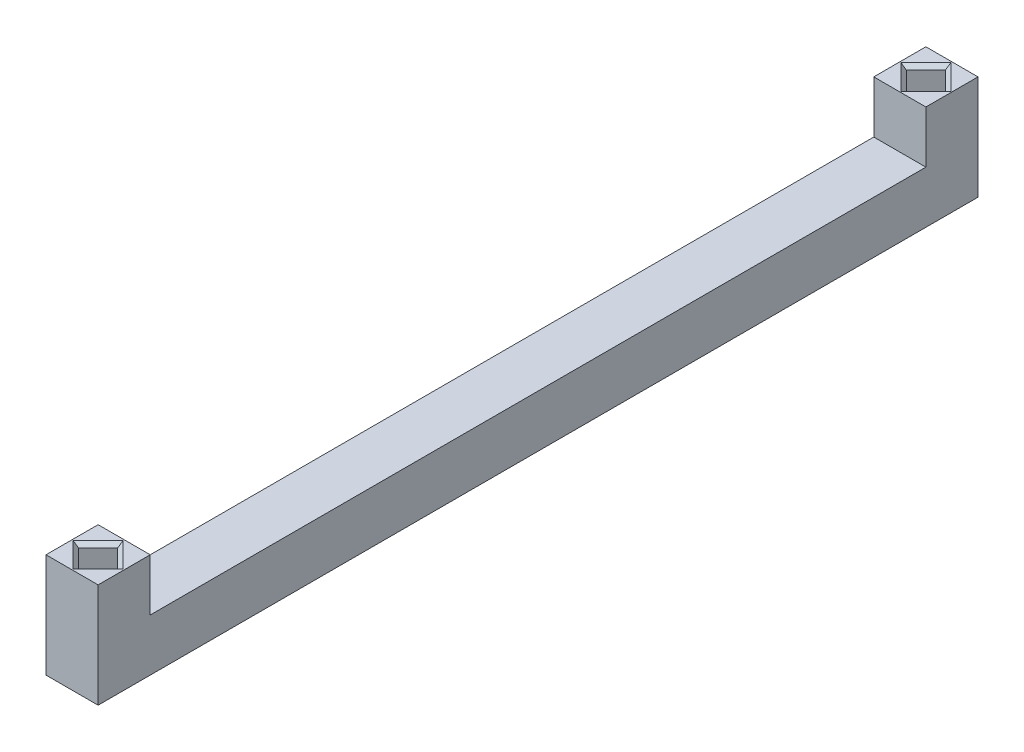
ISO-10303-21;
HEADER;
FILE_DESCRIPTION(('STEP AP214'),'2;1');
FILE_NAME('part.step','',(''),(''),'','','');
FILE_SCHEMA(('AUTOMOTIVE_DESIGN { 1 0 10303 214 1 1 1 1 }'));
ENDSEC;
DATA;
#1=APPLICATION_CONTEXT('core data for automotive mechanical design processes');
#2=APPLICATION_PROTOCOL_DEFINITION('international standard','automotive_design',2000,#1);
#3=PRODUCT_CONTEXT('',#1,'mechanical');
#4=PRODUCT('Part','Part','',(#3));
#5=PRODUCT_RELATED_PRODUCT_CATEGORY('part','',(#4));
#6=PRODUCT_DEFINITION_FORMATION('','',#4);
#7=PRODUCT_DEFINITION_CONTEXT('part definition',#1,'design');
#8=PRODUCT_DEFINITION('design','',#6,#7);
#9=PRODUCT_DEFINITION_SHAPE('','',#8);
#10=(LENGTH_UNIT() NAMED_UNIT(*) SI_UNIT(.MILLI.,.METRE.));
#11=(NAMED_UNIT(*) PLANE_ANGLE_UNIT() SI_UNIT($,.RADIAN.));
#12=(NAMED_UNIT(*) SI_UNIT($,.STERADIAN.) SOLID_ANGLE_UNIT());
#13=UNCERTAINTY_MEASURE_WITH_UNIT(LENGTH_MEASURE(1.E-05),#10,'distance_accuracy_value','');
#14=(GEOMETRIC_REPRESENTATION_CONTEXT(3) GLOBAL_UNCERTAINTY_ASSIGNED_CONTEXT((#13)) GLOBAL_UNIT_ASSIGNED_CONTEXT((#10,
#11,#12)) REPRESENTATION_CONTEXT('',''));
#15=CARTESIAN_POINT('',(0.,0.,0.));
#16=DIRECTION('',(0.,0.,1.));
#17=DIRECTION('',(1.,0.,0.));
#18=AXIS2_PLACEMENT_3D('',#15,#16,#17);
#19=CARTESIAN_POINT('',(8.46666666666667,-8.46666666666666,71.466673));
#20=DIRECTION('',(0.,1.,0.));
#21=DIRECTION('',(0.,0.,1.));
#22=AXIS2_PLACEMENT_3D('',#19,#20,#21);
#23=PLANE('',#22);
#24=DIRECTION('',(0.,0.,-1.));
#25=VECTOR('',#24,1.);
#26=CARTESIAN_POINT('',(0.,-8.46666666666666,71.466673));
#27=LINE('',#26,#25);
#28=CARTESIAN_POINT('',(0.,-8.46666666666666,71.466673));
#29=VERTEX_POINT('',#28);
#30=CARTESIAN_POINT('',(0.,-8.46666666666669,-71.466673));
#31=VERTEX_POINT('',#30);
#32=EDGE_CURVE('E226',#29,#31,#27,.T.);
#33=ORIENTED_EDGE('',*,*,#32,.T.);
#34=DIRECTION('',(-1.,0.,0.));
#35=VECTOR('',#34,1.);
#36=CARTESIAN_POINT('',(8.46666666666667,-8.46666666666669,-71.466673));
#37=LINE('',#36,#35);
#38=CARTESIAN_POINT('',(8.46666666666667,-8.46666666666669,-71.466673));
#39=VERTEX_POINT('',#38);
#40=EDGE_CURVE('E207',#39,#31,#37,.T.);
#41=ORIENTED_EDGE('',*,*,#40,.F.);
#42=DIRECTION('',(0.,0.,-1.));
#43=VECTOR('',#42,1.);
#44=CARTESIAN_POINT('',(8.46666666666667,-8.46666666666666,71.466673));
#45=LINE('',#44,#43);
#46=CARTESIAN_POINT('',(8.46666666666667,-8.46666666666666,71.466673));
#47=VERTEX_POINT('',#46);
#48=EDGE_CURVE('E214',#47,#39,#45,.T.);
#49=ORIENTED_EDGE('',*,*,#48,.F.);
#50=DIRECTION('',(-1.,0.,0.));
#51=VECTOR('',#50,1.);
#52=CARTESIAN_POINT('',(8.46666666666667,-8.46666666666666,71.466673));
#53=LINE('',#52,#51);
#54=EDGE_CURVE('E372',#47,#29,#53,.T.);
#55=ORIENTED_EDGE('',*,*,#54,.T.);
#56=EDGE_LOOP('',(#33,#41,#49,#55));
#57=FACE_BOUND('',#56,.T.);
#58=ADVANCED_FACE('F41',(#57),#23,.F.);
#59=CARTESIAN_POINT('',(8.46666666666667,-8.46666666666669,-71.466673));
#60=DIRECTION('',(0.,0.,1.));
#61=DIRECTION('',(1.,0.,0.));
#62=AXIS2_PLACEMENT_3D('',#59,#60,#61);
#63=PLANE('',#62);
#64=DIRECTION('',(0.,1.,0.));
#65=VECTOR('',#64,1.);
#66=CARTESIAN_POINT('',(0.,-8.46666666666669,-71.466673));
#67=LINE('',#66,#65);
#68=CARTESIAN_POINT('',(0.,8.46666666666669,-71.466673));
#69=VERTEX_POINT('',#68);
#70=EDGE_CURVE('E401',#31,#69,#67,.T.);
#71=ORIENTED_EDGE('',*,*,#70,.T.);
#72=DIRECTION('',(-1.,0.,0.));
#73=VECTOR('',#72,1.);
#74=CARTESIAN_POINT('',(8.46666666666667,8.46666666666669,-71.466673));
#75=LINE('',#74,#73);
#76=CARTESIAN_POINT('',(8.46666666666667,8.46666666666669,-71.466673));
#77=VERTEX_POINT('',#76);
#78=EDGE_CURVE('E210',#77,#69,#75,.T.);
#79=ORIENTED_EDGE('',*,*,#78,.F.);
#80=DIRECTION('',(0.,1.,0.));
#81=VECTOR('',#80,1.);
#82=CARTESIAN_POINT('',(8.46666666666667,-8.46666666666669,-71.466673));
#83=LINE('',#82,#81);
#84=EDGE_CURVE('E203',#39,#77,#83,.T.);
#85=ORIENTED_EDGE('',*,*,#84,.F.);
#86=ORIENTED_EDGE('',*,*,#40,.T.);
#87=EDGE_LOOP('',(#71,#79,#85,#86));
#88=FACE_BOUND('',#87,.T.);
#89=ADVANCED_FACE('F205',(#88),#63,.F.);
#90=CARTESIAN_POINT('',(8.46666666666667,8.46666666666669,-71.466673));
#91=DIRECTION('',(0.,-1.,0.));
#92=DIRECTION('',(0.,0.,-1.));
#93=AXIS2_PLACEMENT_3D('',#90,#91,#92);
#94=PLANE('',#93);
#95=DIRECTION('',(-0.707106781186547,0.,-0.707106781186548));
#96=VECTOR('',#95,1.);
#97=CARTESIAN_POINT('',(2.19682052727985,8.46666666666669,-65.1968268606132));
#98=LINE('',#97,#96);
#99=CARTESIAN_POINT('',(4.23333333333333,8.46666666666669,-63.1603140545597));
#100=VERTEX_POINT('',#99);
#101=CARTESIAN_POINT('',(0.160307721226376,8.46666666666669,-67.2333396666667));
#102=VERTEX_POINT('',#101);
#103=EDGE_CURVE('E290',#100,#102,#98,.T.);
#104=ORIENTED_EDGE('',*,*,#103,.T.);
#105=DIRECTION('',(0.707106781186547,0.,-0.707106781186548));
#106=VECTOR('',#105,1.);
#107=CARTESIAN_POINT('',(6.43015386061318,8.46666666666669,-73.5031858060535));
#108=LINE('',#107,#106);
#109=CARTESIAN_POINT('',(4.23333333333334,8.46666666666669,-71.3063652787736));
#110=VERTEX_POINT('',#109);
#111=EDGE_CURVE('E292',#102,#110,#108,.T.);
#112=ORIENTED_EDGE('',*,*,#111,.T.);
#113=DIRECTION('',(0.707106781186547,0.,0.707106781186548));
#114=VECTOR('',#113,1.);
#115=CARTESIAN_POINT('',(6.26984613938682,8.46666666666669,-69.2698524727201));
#116=LINE('',#115,#114);
#117=CARTESIAN_POINT('',(8.3063589454403,8.46666666666669,-67.2333396666667));
#118=VERTEX_POINT('',#117);
#119=EDGE_CURVE('E286',#110,#118,#116,.T.);
#120=ORIENTED_EDGE('',*,*,#119,.T.);
#121=DIRECTION('',(-0.707106781186548,0.,0.707106781186547));
#122=VECTOR('',#121,1.);
#123=CARTESIAN_POINT('',(10.5031794727201,8.46666666666669,-69.4301601939465));
#124=LINE('',#123,#122);
#125=EDGE_CURVE('E288',#118,#100,#124,.T.);
#126=ORIENTED_EDGE('',*,*,#125,.T.);
#127=EDGE_LOOP('',(#104,#112,#120,#126));
#128=FACE_BOUND('',#127,.T.);
#129=DIRECTION('',(0.,0.,1.));
#130=VECTOR('',#129,1.);
#131=CARTESIAN_POINT('',(0.,8.46666666666669,-71.466673));
#132=LINE('',#131,#130);
#133=CARTESIAN_POINT('',(0.,8.46666666666669,-63.0000063333333));
#134=VERTEX_POINT('',#133);
#135=EDGE_CURVE('E397',#69,#134,#132,.T.);
#136=ORIENTED_EDGE('',*,*,#135,.T.);
#137=DIRECTION('',(-1.,0.,0.));
#138=VECTOR('',#137,1.);
#139=CARTESIAN_POINT('',(8.46666666666667,8.46666666666669,-63.0000063333333));
#140=LINE('',#139,#138);
#141=CARTESIAN_POINT('',(8.46666666666667,8.46666666666669,-63.0000063333333));
#142=VERTEX_POINT('',#141);
#143=EDGE_CURVE('E231',#142,#134,#140,.T.);
#144=ORIENTED_EDGE('',*,*,#143,.F.);
#145=DIRECTION('',(0.,0.,1.));
#146=VECTOR('',#145,1.);
#147=CARTESIAN_POINT('',(8.46666666666667,8.46666666666669,-71.466673));
#148=LINE('',#147,#146);
#149=EDGE_CURVE('E213',#77,#142,#148,.T.);
#150=ORIENTED_EDGE('',*,*,#149,.F.);
#151=ORIENTED_EDGE('',*,*,#78,.T.);
#152=EDGE_LOOP('',(#136,#144,#150,#151));
#153=FACE_BOUND('',#152,.T.);
#154=ADVANCED_FACE('F421',(#128,#153),#94,.F.);
#155=CARTESIAN_POINT('',(8.46666666666667,8.46666666666669,-63.0000063333333));
#156=DIRECTION('',(0.,0.,-1.));
#157=DIRECTION('',(-1.,0.,0.));
#158=AXIS2_PLACEMENT_3D('',#155,#156,#157);
#159=PLANE('',#158);
#160=DIRECTION('',(0.,-1.,0.));
#161=VECTOR('',#160,1.);
#162=CARTESIAN_POINT('',(0.,8.46666666666669,-63.0000063333333));
#163=LINE('',#162,#161);
#164=CARTESIAN_POINT('',(0.,0.,-63.0000063333333));
#165=VERTEX_POINT('',#164);
#166=EDGE_CURVE('E392',#134,#165,#163,.T.);
#167=ORIENTED_EDGE('',*,*,#166,.T.);
#168=DIRECTION('',(-1.,0.,0.));
#169=VECTOR('',#168,1.);
#170=CARTESIAN_POINT('',(8.46666666666667,0.,-63.0000063333333));
#171=LINE('',#170,#169);
#172=CARTESIAN_POINT('',(8.46666666666667,0.,-63.0000063333333));
#173=VERTEX_POINT('',#172);
#174=EDGE_CURVE('E383',#173,#165,#171,.T.);
#175=ORIENTED_EDGE('',*,*,#174,.F.);
#176=DIRECTION('',(0.,-1.,0.));
#177=VECTOR('',#176,1.);
#178=CARTESIAN_POINT('',(8.46666666666667,8.46666666666669,-63.0000063333333));
#179=LINE('',#178,#177);
#180=EDGE_CURVE('E393',#142,#173,#179,.T.);
#181=ORIENTED_EDGE('',*,*,#180,.F.);
#182=ORIENTED_EDGE('',*,*,#143,.T.);
#183=EDGE_LOOP('',(#167,#175,#181,#182));
#184=FACE_BOUND('',#183,.T.);
#185=ADVANCED_FACE('F390',(#184),#159,.F.);
#186=CARTESIAN_POINT('',(8.46666666666667,0.,-63.0000063333333));
#187=DIRECTION('',(0.,-1.,0.));
#188=DIRECTION('',(0.,0.,-1.));
#189=AXIS2_PLACEMENT_3D('',#186,#187,#188);
#190=PLANE('',#189);
#191=DIRECTION('',(0.,0.,1.));
#192=VECTOR('',#191,1.);
#193=CARTESIAN_POINT('',(0.,0.,-63.0000063333333));
#194=LINE('',#193,#192);
#195=CARTESIAN_POINT('',(0.,0.,63.0000063333333));
#196=VERTEX_POINT('',#195);
#197=EDGE_CURVE('E398',#165,#196,#194,.T.);
#198=ORIENTED_EDGE('',*,*,#197,.T.);
#199=DIRECTION('',(-1.,0.,0.));
#200=VECTOR('',#199,1.);
#201=CARTESIAN_POINT('',(8.46666666666667,0.,63.0000063333333));
#202=LINE('',#201,#200);
#203=CARTESIAN_POINT('',(8.46666666666667,0.,63.0000063333333));
#204=VERTEX_POINT('',#203);
#205=EDGE_CURVE('E380',#204,#196,#202,.T.);
#206=ORIENTED_EDGE('',*,*,#205,.F.);
#207=DIRECTION('',(0.,0.,1.));
#208=VECTOR('',#207,1.);
#209=CARTESIAN_POINT('',(8.46666666666667,0.,-63.0000063333333));
#210=LINE('',#209,#208);
#211=EDGE_CURVE('E411',#173,#204,#210,.T.);
#212=ORIENTED_EDGE('',*,*,#211,.F.);
#213=ORIENTED_EDGE('',*,*,#174,.T.);
#214=EDGE_LOOP('',(#198,#206,#212,#213));
#215=FACE_BOUND('',#214,.T.);
#216=ADVANCED_FACE('F410',(#215),#190,.F.);
#217=CARTESIAN_POINT('',(8.46666666666667,0.,63.0000063333333));
#218=DIRECTION('',(0.,0.,1.));
#219=DIRECTION('',(1.,0.,0.));
#220=AXIS2_PLACEMENT_3D('',#217,#218,#219);
#221=PLANE('',#220);
#222=DIRECTION('',(0.,1.,0.));
#223=VECTOR('',#222,1.);
#224=CARTESIAN_POINT('',(0.,0.,63.0000063333333));
#225=LINE('',#224,#223);
#226=CARTESIAN_POINT('',(0.,8.46666666666667,63.0000063333333));
#227=VERTEX_POINT('',#226);
#228=EDGE_CURVE('E369',#196,#227,#225,.T.);
#229=ORIENTED_EDGE('',*,*,#228,.T.);
#230=DIRECTION('',(-1.,0.,0.));
#231=VECTOR('',#230,1.);
#232=CARTESIAN_POINT('',(8.46666666666667,8.46666666666667,63.0000063333333));
#233=LINE('',#232,#231);
#234=CARTESIAN_POINT('',(8.46666666666667,8.46666666666667,63.0000063333333));
#235=VERTEX_POINT('',#234);
#236=EDGE_CURVE('E365',#235,#227,#233,.T.);
#237=ORIENTED_EDGE('',*,*,#236,.F.);
#238=DIRECTION('',(0.,1.,0.));
#239=VECTOR('',#238,1.);
#240=CARTESIAN_POINT('',(8.46666666666667,0.,63.0000063333333));
#241=LINE('',#240,#239);
#242=EDGE_CURVE('E407',#204,#235,#241,.T.);
#243=ORIENTED_EDGE('',*,*,#242,.F.);
#244=ORIENTED_EDGE('',*,*,#205,.T.);
#245=EDGE_LOOP('',(#229,#237,#243,#244));
#246=FACE_BOUND('',#245,.T.);
#247=ADVANCED_FACE('F355',(#246),#221,.F.);
#248=CARTESIAN_POINT('',(8.46666666666667,8.46666666666667,63.0000063333333));
#249=DIRECTION('',(0.,-1.,0.));
#250=DIRECTION('',(0.,0.,-1.));
#251=AXIS2_PLACEMENT_3D('',#248,#249,#250);
#252=PLANE('',#251);
#253=DIRECTION('',(-0.707106781186548,0.,-0.707106781186547));
#254=VECTOR('',#253,1.);
#255=CARTESIAN_POINT('',(2.19682052727988,8.46666666666667,69.2698524727201));
#256=LINE('',#255,#254);
#257=CARTESIAN_POINT('',(4.23333333333334,8.46666666666667,71.3063652787736));
#258=VERTEX_POINT('',#257);
#259=CARTESIAN_POINT('',(0.16030772122642,8.46666666666667,67.2333396666667));
#260=VERTEX_POINT('',#259);
#261=EDGE_CURVE('E51',#258,#260,#256,.T.);
#262=ORIENTED_EDGE('',*,*,#261,.T.);
#263=DIRECTION('',(0.707106781186548,0.,-0.707106781186547));
#264=VECTOR('',#263,1.);
#265=CARTESIAN_POINT('',(6.43015386061322,8.46666666666667,60.9634935272799));
#266=LINE('',#265,#264);
#267=CARTESIAN_POINT('',(4.23333333333333,8.46666666666667,63.1603140545598));
#268=VERTEX_POINT('',#267);
#269=EDGE_CURVE('E11',#260,#268,#266,.T.);
#270=ORIENTED_EDGE('',*,*,#269,.T.);
#271=DIRECTION('',(0.707106781186547,0.,0.707106781186548));
#272=VECTOR('',#271,1.);
#273=CARTESIAN_POINT('',(6.26984613938679,8.46666666666667,65.1968268606132));
#274=LINE('',#273,#272);
#275=CARTESIAN_POINT('',(8.30635894544025,8.46666666666667,67.2333396666667));
#276=VERTEX_POINT('',#275);
#277=EDGE_CURVE('E295',#268,#276,#274,.T.);
#278=ORIENTED_EDGE('',*,*,#277,.T.);
#279=DIRECTION('',(-0.707106781186547,0.,0.707106781186548));
#280=VECTOR('',#279,1.);
#281=CARTESIAN_POINT('',(10.5031794727201,8.46666666666667,65.0365191393868));
#282=LINE('',#281,#280);
#283=EDGE_CURVE('E62',#276,#258,#282,.T.);
#284=ORIENTED_EDGE('',*,*,#283,.T.);
#285=EDGE_LOOP('',(#262,#270,#278,#284));
#286=FACE_BOUND('',#285,.T.);
#287=DIRECTION('',(0.,0.,1.));
#288=VECTOR('',#287,1.);
#289=CARTESIAN_POINT('',(0.,8.46666666666667,63.0000063333333));
#290=LINE('',#289,#288);
#291=CARTESIAN_POINT('',(0.,8.46666666666667,71.466673));
#292=VERTEX_POINT('',#291);
#293=EDGE_CURVE('E360',#227,#292,#290,.T.);
#294=ORIENTED_EDGE('',*,*,#293,.T.);
#295=DIRECTION('',(-1.,0.,0.));
#296=VECTOR('',#295,1.);
#297=CARTESIAN_POINT('',(8.46666666666667,8.46666666666667,71.466673));
#298=LINE('',#297,#296);
#299=CARTESIAN_POINT('',(8.46666666666667,8.46666666666667,71.466673));
#300=VERTEX_POINT('',#299);
#301=EDGE_CURVE('E363',#300,#292,#298,.T.);
#302=ORIENTED_EDGE('',*,*,#301,.F.);
#303=DIRECTION('',(0.,0.,1.));
#304=VECTOR('',#303,1.);
#305=CARTESIAN_POINT('',(8.46666666666667,8.46666666666667,63.0000063333333));
#306=LINE('',#305,#304);
#307=EDGE_CURVE('E413',#235,#300,#306,.T.);
#308=ORIENTED_EDGE('',*,*,#307,.F.);
#309=ORIENTED_EDGE('',*,*,#236,.T.);
#310=EDGE_LOOP('',(#294,#302,#308,#309));
#311=FACE_BOUND('',#310,.T.);
#312=ADVANCED_FACE('F351',(#286,#311),#252,.F.);
#313=CARTESIAN_POINT('',(8.46666666666667,8.46666666666667,71.466673));
#314=DIRECTION('',(0.,0.,-1.));
#315=DIRECTION('',(-1.,0.,0.));
#316=AXIS2_PLACEMENT_3D('',#313,#314,#315);
#317=PLANE('',#316);
#318=DIRECTION('',(0.,-1.,0.));
#319=VECTOR('',#318,1.);
#320=CARTESIAN_POINT('',(0.,8.46666666666667,71.466673));
#321=LINE('',#320,#319);
#322=EDGE_CURVE('E223',#292,#29,#321,.T.);
#323=ORIENTED_EDGE('',*,*,#322,.T.);
#324=ORIENTED_EDGE('',*,*,#54,.F.);
#325=DIRECTION('',(0.,-1.,0.));
#326=VECTOR('',#325,1.);
#327=CARTESIAN_POINT('',(8.46666666666667,8.46666666666667,71.466673));
#328=LINE('',#327,#326);
#329=EDGE_CURVE('E219',#300,#47,#328,.T.);
#330=ORIENTED_EDGE('',*,*,#329,.F.);
#331=ORIENTED_EDGE('',*,*,#301,.T.);
#332=EDGE_LOOP('',(#323,#324,#330,#331));
#333=FACE_BOUND('',#332,.T.);
#334=ADVANCED_FACE('F354',(#333),#317,.F.);
#335=CARTESIAN_POINT('',(8.46666666666667,0.,0.));
#336=DIRECTION('',(1.,0.,0.));
#337=DIRECTION('',(0.,0.,-1.));
#338=AXIS2_PLACEMENT_3D('',#335,#336,#337);
#339=PLANE('',#338);
#340=ORIENTED_EDGE('',*,*,#48,.T.);
#341=ORIENTED_EDGE('',*,*,#84,.T.);
#342=ORIENTED_EDGE('',*,*,#149,.T.);
#343=ORIENTED_EDGE('',*,*,#180,.T.);
#344=ORIENTED_EDGE('',*,*,#211,.T.);
#345=ORIENTED_EDGE('',*,*,#242,.T.);
#346=ORIENTED_EDGE('',*,*,#307,.T.);
#347=ORIENTED_EDGE('',*,*,#329,.T.);
#348=EDGE_LOOP('',(#340,#341,#342,#343,#344,#345,#346,#347));
#349=FACE_BOUND('',#348,.T.);
#350=ADVANCED_FACE('F217',(#349),#339,.T.);
#351=CARTESIAN_POINT('',(0.,0.,0.));
#352=DIRECTION('',(1.,0.,0.));
#353=DIRECTION('',(0.,0.,-1.));
#354=AXIS2_PLACEMENT_3D('',#351,#352,#353);
#355=PLANE('',#354);
#356=ORIENTED_EDGE('',*,*,#32,.F.);
#357=ORIENTED_EDGE('',*,*,#322,.F.);
#358=ORIENTED_EDGE('',*,*,#293,.F.);
#359=ORIENTED_EDGE('',*,*,#228,.F.);
#360=ORIENTED_EDGE('',*,*,#197,.F.);
#361=ORIENTED_EDGE('',*,*,#166,.F.);
#362=ORIENTED_EDGE('',*,*,#135,.F.);
#363=ORIENTED_EDGE('',*,*,#70,.F.);
#364=EDGE_LOOP('',(#356,#357,#358,#359,#360,#361,#362,#363));
#365=FACE_BOUND('',#364,.T.);
#366=ADVANCED_FACE('F374',(#365),#355,.F.);
#367=CARTESIAN_POINT('',(1.05833333333333,3.38666666666667,67.2333396666667));
#368=DIRECTION('',(-0.707106781186547,0.,0.707106781186548));
#369=DIRECTION('',(0.707106781186548,0.,0.707106781186547));
#370=AXIS2_PLACEMENT_3D('',#367,#368,#369);
#371=PLANE('',#370);
#372=DIRECTION('',(0.,1.,0.));
#373=VECTOR('',#372,1.);
#374=CARTESIAN_POINT('',(4.23333333333333,3.38666666666667,70.4083396666667));
#375=LINE('',#374,#373);
#376=CARTESIAN_POINT('',(4.23333333333333,4.02166666666668,70.4083396666667));
#377=VERTEX_POINT('',#376);
#378=CARTESIAN_POINT('',(4.23333333333333,7.83166666666666,70.4083396666667));
#379=VERTEX_POINT('',#378);
#380=EDGE_CURVE('E434',#377,#379,#375,.T.);
#381=ORIENTED_EDGE('',*,*,#380,.F.);
#382=DIRECTION('',(-0.707106781186548,0.,-0.707106781186547));
#383=VECTOR('',#382,1.);
#384=CARTESIAN_POINT('',(1.05833333333333,4.02166666666668,67.2333396666667));
#385=LINE('',#384,#383);
#386=CARTESIAN_POINT('',(1.05833333333333,4.02166666666668,67.2333396666667));
#387=VERTEX_POINT('',#386);
#388=EDGE_CURVE('E284',#377,#387,#385,.T.);
#389=ORIENTED_EDGE('',*,*,#388,.T.);
#390=DIRECTION('',(0.,1.,0.));
#391=VECTOR('',#390,1.);
#392=CARTESIAN_POINT('',(1.05833333333333,3.38666666666667,67.2333396666667));
#393=LINE('',#392,#391);
#394=CARTESIAN_POINT('',(1.05833333333333,7.83166666666666,67.2333396666667));
#395=VERTEX_POINT('',#394);
#396=EDGE_CURVE('E420',#387,#395,#393,.T.);
#397=ORIENTED_EDGE('',*,*,#396,.T.);
#398=DIRECTION('',(0.707106781186548,0.,0.707106781186547));
#399=VECTOR('',#398,1.);
#400=CARTESIAN_POINT('',(1.05833333333333,7.83166666666666,67.2333396666667));
#401=LINE('',#400,#399);
#402=EDGE_CURVE('E282',#395,#379,#401,.T.);
#403=ORIENTED_EDGE('',*,*,#402,.T.);
#404=EDGE_LOOP('',(#381,#389,#397,#403));
#405=FACE_BOUND('',#404,.T.);
#406=ADVANCED_FACE('F447',(#405),#371,.F.);
#407=CARTESIAN_POINT('',(1.05833333333333,3.38666666666667,67.2333396666667));
#408=DIRECTION('',(-0.707106781186547,0.,-0.707106781186548));
#409=DIRECTION('',(-0.707106781186548,0.,0.707106781186547));
#410=AXIS2_PLACEMENT_3D('',#407,#408,#409);
#411=PLANE('',#410);
#412=ORIENTED_EDGE('',*,*,#396,.F.);
#413=DIRECTION('',(0.707106781186548,0.,-0.707106781186547));
#414=VECTOR('',#413,1.);
#415=CARTESIAN_POINT('',(1.05833333333333,4.02166666666668,67.2333396666667));
#416=LINE('',#415,#414);
#417=CARTESIAN_POINT('',(4.23333333333333,4.02166666666668,64.0583396666667));
#418=VERTEX_POINT('',#417);
#419=EDGE_CURVE('E271',#387,#418,#416,.T.);
#420=ORIENTED_EDGE('',*,*,#419,.T.);
#421=DIRECTION('',(0.,1.,0.));
#422=VECTOR('',#421,1.);
#423=CARTESIAN_POINT('',(4.23333333333333,3.38666666666667,64.0583396666667));
#424=LINE('',#423,#422);
#425=CARTESIAN_POINT('',(4.23333333333333,7.83166666666666,64.0583396666667));
#426=VERTEX_POINT('',#425);
#427=EDGE_CURVE('E440',#418,#426,#424,.T.);
#428=ORIENTED_EDGE('',*,*,#427,.T.);
#429=DIRECTION('',(-0.707106781186548,0.,0.707106781186547));
#430=VECTOR('',#429,1.);
#431=CARTESIAN_POINT('',(1.05833333333333,7.83166666666666,67.2333396666667));
#432=LINE('',#431,#430);
#433=EDGE_CURVE('E268',#426,#395,#432,.T.);
#434=ORIENTED_EDGE('',*,*,#433,.T.);
#435=EDGE_LOOP('',(#412,#420,#428,#434));
#436=FACE_BOUND('',#435,.T.);
#437=ADVANCED_FACE('F451',(#436),#411,.F.);
#438=CARTESIAN_POINT('',(4.23333333333333,3.38666666666667,64.0583396666667));
#439=DIRECTION('',(0.707106781186548,0.,-0.707106781186547));
#440=DIRECTION('',(-0.707106781186547,0.,-0.707106781186548));
#441=AXIS2_PLACEMENT_3D('',#438,#439,#440);
#442=PLANE('',#441);
#443=ORIENTED_EDGE('',*,*,#427,.F.);
#444=DIRECTION('',(0.707106781186547,0.,0.707106781186548));
#445=VECTOR('',#444,1.);
#446=CARTESIAN_POINT('',(4.23333333333333,4.02166666666668,64.0583396666667));
#447=LINE('',#446,#445);
#448=CARTESIAN_POINT('',(7.40833333333333,4.02166666666668,67.2333396666667));
#449=VERTEX_POINT('',#448);
#450=EDGE_CURVE('E276',#418,#449,#447,.T.);
#451=ORIENTED_EDGE('',*,*,#450,.T.);
#452=DIRECTION('',(0.,1.,0.));
#453=VECTOR('',#452,1.);
#454=CARTESIAN_POINT('',(7.40833333333333,3.38666666666667,67.2333396666667));
#455=LINE('',#454,#453);
#456=CARTESIAN_POINT('',(7.40833333333333,7.83166666666666,67.2333396666667));
#457=VERTEX_POINT('',#456);
#458=EDGE_CURVE('E437',#449,#457,#455,.T.);
#459=ORIENTED_EDGE('',*,*,#458,.T.);
#460=DIRECTION('',(-0.707106781186547,0.,-0.707106781186548));
#461=VECTOR('',#460,1.);
#462=CARTESIAN_POINT('',(4.23333333333333,7.83166666666666,64.0583396666667));
#463=LINE('',#462,#461);
#464=EDGE_CURVE('E274',#457,#426,#463,.T.);
#465=ORIENTED_EDGE('',*,*,#464,.T.);
#466=EDGE_LOOP('',(#443,#451,#459,#465));
#467=FACE_BOUND('',#466,.T.);
#468=ADVANCED_FACE('F472',(#467),#442,.F.);
#469=CARTESIAN_POINT('',(4.23333333333333,3.38666666666667,70.4083396666667));
#470=DIRECTION('',(0.707106781186548,0.,0.707106781186547));
#471=DIRECTION('',(0.707106781186547,0.,-0.707106781186548));
#472=AXIS2_PLACEMENT_3D('',#469,#470,#471);
#473=PLANE('',#472);
#474=ORIENTED_EDGE('',*,*,#458,.F.);
#475=DIRECTION('',(-0.707106781186547,0.,0.707106781186548));
#476=VECTOR('',#475,1.);
#477=CARTESIAN_POINT('',(4.23333333333333,4.02166666666668,70.4083396666667));
#478=LINE('',#477,#476);
#479=EDGE_CURVE('E280',#449,#377,#478,.T.);
#480=ORIENTED_EDGE('',*,*,#479,.T.);
#481=ORIENTED_EDGE('',*,*,#380,.T.);
#482=DIRECTION('',(0.707106781186547,0.,-0.707106781186548));
#483=VECTOR('',#482,1.);
#484=CARTESIAN_POINT('',(4.23333333333333,7.83166666666666,70.4083396666667));
#485=LINE('',#484,#483);
#486=EDGE_CURVE('E278',#379,#457,#485,.T.);
#487=ORIENTED_EDGE('',*,*,#486,.T.);
#488=EDGE_LOOP('',(#474,#480,#481,#487));
#489=FACE_BOUND('',#488,.T.);
#490=ADVANCED_FACE('F475',(#489),#473,.F.);
#491=CARTESIAN_POINT('',(0.,3.38666666666667,0.));
#492=DIRECTION('',(0.,1.,0.));
#493=DIRECTION('',(0.,0.,1.));
#494=AXIS2_PLACEMENT_3D('',#491,#492,#493);
#495=PLANE('',#494);
#496=DIRECTION('',(-0.707106781186547,0.,-0.707106781186548));
#497=VECTOR('',#496,1.);
#498=CARTESIAN_POINT('',(-30.3615159727202,3.38666666666667,30.3615159727201));
#499=LINE('',#498,#497);
#500=CARTESIAN_POINT('',(6.51030772122636,3.38666666666667,67.2333396666667));
#501=VERTEX_POINT('',#500);
#502=CARTESIAN_POINT('',(4.23333333333333,3.38666666666667,64.9563652787736));
#503=VERTEX_POINT('',#502);
#504=EDGE_CURVE('E263',#501,#503,#499,.T.);
#505=ORIENTED_EDGE('',*,*,#504,.T.);
#506=DIRECTION('',(-0.707106781186548,0.,0.707106781186547));
#507=VECTOR('',#506,1.);
#508=CARTESIAN_POINT('',(34.5948493060535,3.38666666666667,34.5948493060535));
#509=LINE('',#508,#507);
#510=CARTESIAN_POINT('',(1.9563589454403,3.38666666666667,67.2333396666667));
#511=VERTEX_POINT('',#510);
#512=EDGE_CURVE('E265',#503,#511,#509,.T.);
#513=ORIENTED_EDGE('',*,*,#512,.T.);
#514=DIRECTION('',(0.707106781186548,0.,0.707106781186547));
#515=VECTOR('',#514,1.);
#516=CARTESIAN_POINT('',(-32.6384903606132,3.38666666666667,32.6384903606132));
#517=LINE('',#516,#515);
#518=CARTESIAN_POINT('',(4.23333333333333,3.38666666666667,69.5103140545597));
#519=VERTEX_POINT('',#518);
#520=EDGE_CURVE('E259',#511,#519,#517,.T.);
#521=ORIENTED_EDGE('',*,*,#520,.T.);
#522=DIRECTION('',(0.707106781186547,0.,-0.707106781186548));
#523=VECTOR('',#522,1.);
#524=CARTESIAN_POINT('',(36.8718236939465,3.38666666666667,36.8718236939465));
#525=LINE('',#524,#523);
#526=EDGE_CURVE('E261',#519,#501,#525,.T.);
#527=ORIENTED_EDGE('',*,*,#526,.T.);
#528=EDGE_LOOP('',(#505,#513,#521,#527));
#529=FACE_BOUND('',#528,.T.);
#530=ADVANCED_FACE('F465',(#529),#495,.T.);
#531=CARTESIAN_POINT('',(1.05833333333335,3.38666666666667,-67.2333396666667));
#532=DIRECTION('',(-0.707106781186548,0.,0.707106781186547));
#533=DIRECTION('',(0.707106781186547,0.,0.707106781186548));
#534=AXIS2_PLACEMENT_3D('',#531,#532,#533);
#535=PLANE('',#534);
#536=DIRECTION('',(0.,1.,0.));
#537=VECTOR('',#536,1.);
#538=CARTESIAN_POINT('',(4.23333333333334,3.38666666666667,-64.0583396666667));
#539=LINE('',#538,#537);
#540=CARTESIAN_POINT('',(4.23333333333334,4.02166666666666,-64.0583396666667));
#541=VERTEX_POINT('',#540);
#542=CARTESIAN_POINT('',(4.23333333333334,7.83166666666665,-64.0583396666667));
#543=VERTEX_POINT('',#542);
#544=EDGE_CURVE('E431',#541,#543,#539,.T.);
#545=ORIENTED_EDGE('',*,*,#544,.F.);
#546=DIRECTION('',(-0.707106781186547,0.,-0.707106781186548));
#547=VECTOR('',#546,1.);
#548=CARTESIAN_POINT('',(1.05833333333335,4.02166666666666,-67.2333396666667));
#549=LINE('',#548,#547);
#550=CARTESIAN_POINT('',(1.05833333333335,4.02166666666666,-67.2333396666667));
#551=VERTEX_POINT('',#550);
#552=EDGE_CURVE('E257',#541,#551,#549,.T.);
#553=ORIENTED_EDGE('',*,*,#552,.T.);
#554=DIRECTION('',(0.,1.,0.));
#555=VECTOR('',#554,1.);
#556=CARTESIAN_POINT('',(1.05833333333335,3.38666666666667,-67.2333396666667));
#557=LINE('',#556,#555);
#558=CARTESIAN_POINT('',(1.05833333333335,7.83166666666665,-67.2333396666667));
#559=VERTEX_POINT('',#558);
#560=EDGE_CURVE('E310',#551,#559,#557,.T.);
#561=ORIENTED_EDGE('',*,*,#560,.T.);
#562=DIRECTION('',(0.707106781186547,0.,0.707106781186548));
#563=VECTOR('',#562,1.);
#564=CARTESIAN_POINT('',(1.05833333333335,7.83166666666665,-67.2333396666667));
#565=LINE('',#564,#563);
#566=EDGE_CURVE('E255',#559,#543,#565,.T.);
#567=ORIENTED_EDGE('',*,*,#566,.T.);
#568=EDGE_LOOP('',(#545,#553,#561,#567));
#569=FACE_BOUND('',#568,.T.);
#570=ADVANCED_FACE('F681',(#569),#535,.F.);
#571=CARTESIAN_POINT('',(1.05833333333335,3.38666666666667,-67.2333396666667));
#572=DIRECTION('',(-0.707106781186548,0.,-0.707106781186547));
#573=DIRECTION('',(-0.707106781186547,0.,0.707106781186548));
#574=AXIS2_PLACEMENT_3D('',#571,#572,#573);
#575=PLANE('',#574);
#576=ORIENTED_EDGE('',*,*,#560,.F.);
#577=DIRECTION('',(0.707106781186547,0.,-0.707106781186548));
#578=VECTOR('',#577,1.);
#579=CARTESIAN_POINT('',(1.05833333333335,4.02166666666666,-67.2333396666667));
#580=LINE('',#579,#578);
#581=CARTESIAN_POINT('',(4.23333333333334,4.02166666666667,-70.4083396666667));
#582=VERTEX_POINT('',#581);
#583=EDGE_CURVE('E244',#551,#582,#580,.T.);
#584=ORIENTED_EDGE('',*,*,#583,.T.);
#585=DIRECTION('',(0.,1.,0.));
#586=VECTOR('',#585,1.);
#587=CARTESIAN_POINT('',(4.23333333333334,3.38666666666667,-70.4083396666667));
#588=LINE('',#587,#586);
#589=CARTESIAN_POINT('',(4.23333333333334,7.83166666666665,-70.4083396666667));
#590=VERTEX_POINT('',#589);
#591=EDGE_CURVE('E425',#582,#590,#588,.T.);
#592=ORIENTED_EDGE('',*,*,#591,.T.);
#593=DIRECTION('',(-0.707106781186547,0.,0.707106781186548));
#594=VECTOR('',#593,1.);
#595=CARTESIAN_POINT('',(1.05833333333335,7.83166666666665,-67.2333396666667));
#596=LINE('',#595,#594);
#597=EDGE_CURVE('E241',#590,#559,#596,.T.);
#598=ORIENTED_EDGE('',*,*,#597,.T.);
#599=EDGE_LOOP('',(#576,#584,#592,#598));
#600=FACE_BOUND('',#599,.T.);
#601=ADVANCED_FACE('F672',(#600),#575,.F.);
#602=CARTESIAN_POINT('',(4.23333333333334,3.38666666666667,-70.4083396666667));
#603=DIRECTION('',(0.707106781186548,0.,-0.707106781186547));
#604=DIRECTION('',(-0.707106781186547,0.,-0.707106781186548));
#605=AXIS2_PLACEMENT_3D('',#602,#603,#604);
#606=PLANE('',#605);
#607=ORIENTED_EDGE('',*,*,#591,.F.);
#608=DIRECTION('',(0.707106781186547,0.,0.707106781186548));
#609=VECTOR('',#608,1.);
#610=CARTESIAN_POINT('',(4.23333333333334,4.02166666666667,-70.4083396666667));
#611=LINE('',#610,#609);
#612=CARTESIAN_POINT('',(7.40833333333333,4.02166666666666,-67.2333396666667));
#613=VERTEX_POINT('',#612);
#614=EDGE_CURVE('E249',#582,#613,#611,.T.);
#615=ORIENTED_EDGE('',*,*,#614,.T.);
#616=DIRECTION('',(0.,1.,0.));
#617=VECTOR('',#616,1.);
#618=CARTESIAN_POINT('',(7.40833333333333,3.38666666666667,-67.2333396666667));
#619=LINE('',#618,#617);
#620=CARTESIAN_POINT('',(7.40833333333333,7.83166666666665,-67.2333396666667));
#621=VERTEX_POINT('',#620);
#622=EDGE_CURVE('E428',#613,#621,#619,.T.);
#623=ORIENTED_EDGE('',*,*,#622,.T.);
#624=DIRECTION('',(-0.707106781186547,0.,-0.707106781186548));
#625=VECTOR('',#624,1.);
#626=CARTESIAN_POINT('',(4.23333333333334,7.83166666666665,-70.4083396666667));
#627=LINE('',#626,#625);
#628=EDGE_CURVE('E247',#621,#590,#627,.T.);
#629=ORIENTED_EDGE('',*,*,#628,.T.);
#630=EDGE_LOOP('',(#607,#615,#623,#629));
#631=FACE_BOUND('',#630,.T.);
#632=ADVANCED_FACE('F663',(#631),#606,.F.);
#633=CARTESIAN_POINT('',(4.23333333333334,3.38666666666667,-64.0583396666667));
#634=DIRECTION('',(0.707106781186547,0.,0.707106781186548));
#635=DIRECTION('',(0.707106781186548,0.,-0.707106781186547));
#636=AXIS2_PLACEMENT_3D('',#633,#634,#635);
#637=PLANE('',#636);
#638=ORIENTED_EDGE('',*,*,#622,.F.);
#639=DIRECTION('',(-0.707106781186548,0.,0.707106781186547));
#640=VECTOR('',#639,1.);
#641=CARTESIAN_POINT('',(4.23333333333334,4.02166666666666,-64.0583396666667));
#642=LINE('',#641,#640);
#643=EDGE_CURVE('E253',#613,#541,#642,.T.);
#644=ORIENTED_EDGE('',*,*,#643,.T.);
#645=ORIENTED_EDGE('',*,*,#544,.T.);
#646=DIRECTION('',(0.707106781186548,0.,-0.707106781186547));
#647=VECTOR('',#646,1.);
#648=CARTESIAN_POINT('',(4.23333333333334,7.83166666666665,-64.0583396666667));
#649=LINE('',#648,#647);
#650=EDGE_CURVE('E251',#543,#621,#649,.T.);
#651=ORIENTED_EDGE('',*,*,#650,.T.);
#652=EDGE_LOOP('',(#638,#644,#645,#651));
#653=FACE_BOUND('',#652,.T.);
#654=ADVANCED_FACE('F654',(#653),#637,.F.);
#655=CARTESIAN_POINT('',(0.,3.38666666666667,0.));
#656=DIRECTION('',(0.,1.,0.));
#657=DIRECTION('',(0.,0.,1.));
#658=AXIS2_PLACEMENT_3D('',#655,#656,#657);
#659=PLANE('',#658);
#660=DIRECTION('',(-0.707106781186547,0.,-0.707106781186548));
#661=VECTOR('',#660,1.);
#662=CARTESIAN_POINT('',(36.8718236939465,3.38666666666667,-36.8718236939465));
#663=LINE('',#662,#661);
#664=CARTESIAN_POINT('',(6.51030772122642,3.38666666666667,-67.2333396666667));
#665=VERTEX_POINT('',#664);
#666=CARTESIAN_POINT('',(4.23333333333334,3.38666666666667,-69.5103140545597));
#667=VERTEX_POINT('',#666);
#668=EDGE_CURVE('E236',#665,#667,#663,.T.);
#669=ORIENTED_EDGE('',*,*,#668,.T.);
#670=DIRECTION('',(-0.707106781186547,0.,0.707106781186548));
#671=VECTOR('',#670,1.);
#672=CARTESIAN_POINT('',(-32.6384903606132,3.38666666666667,-32.6384903606132));
#673=LINE('',#672,#671);
#674=CARTESIAN_POINT('',(1.95635894544027,3.38666666666667,-67.2333396666667));
#675=VERTEX_POINT('',#674);
#676=EDGE_CURVE('E238',#667,#675,#673,.T.);
#677=ORIENTED_EDGE('',*,*,#676,.T.);
#678=DIRECTION('',(0.707106781186547,0.,0.707106781186548));
#679=VECTOR('',#678,1.);
#680=CARTESIAN_POINT('',(34.5948493060535,3.38666666666667,-34.5948493060534));
#681=LINE('',#680,#679);
#682=CARTESIAN_POINT('',(4.23333333333334,3.38666666666667,-64.9563652787736));
#683=VERTEX_POINT('',#682);
#684=EDGE_CURVE('E227',#675,#683,#681,.T.);
#685=ORIENTED_EDGE('',*,*,#684,.T.);
#686=DIRECTION('',(0.707106781186548,0.,-0.707106781186547));
#687=VECTOR('',#686,1.);
#688=CARTESIAN_POINT('',(-30.3615159727201,3.38666666666667,-30.3615159727201));
#689=LINE('',#688,#687);
#690=EDGE_CURVE('E229',#683,#665,#689,.T.);
#691=ORIENTED_EDGE('',*,*,#690,.T.);
#692=EDGE_LOOP('',(#669,#677,#685,#691));
#693=FACE_BOUND('',#692,.T.);
#694=ADVANCED_FACE('F521',(#693),#659,.T.);
#695=CARTESIAN_POINT('',(-30.3615159727201,3.38666666666667,-30.3615159727201));
#696=DIRECTION('',(0.499999999999998,-0.707106781186549,0.499999999999999));
#697=DIRECTION('',(0.707106781186548,0.,-0.707106781186547));
#698=AXIS2_PLACEMENT_3D('',#695,#696,#697);
#699=PLANE('',#698);
#700=DIRECTION('',(0.,-0.577350269189623,-0.816496580927728));
#701=VECTOR('',#700,1.);
#702=CARTESIAN_POINT('',(4.23333333333333,19.6948350256247,-41.8931324080712));
#703=LINE('',#702,#701);
#704=EDGE_CURVE('E304',#541,#683,#703,.T.);
#705=ORIENTED_EDGE('',*,*,#704,.F.);
#706=ORIENTED_EDGE('',*,*,#643,.F.);
#707=DIRECTION('',(-0.816496580927729,-0.577350269189622,0.));
#708=VECTOR('',#707,1.);
#709=CARTESIAN_POINT('',(26.7513183697065,17.6992225542759,-67.2333396666668));
#710=LINE('',#709,#708);
#711=EDGE_CURVE('E307',#665,#613,#710,.F.);
#712=ORIENTED_EDGE('',*,*,#711,.F.);
#713=ORIENTED_EDGE('',*,*,#690,.F.);
#714=EDGE_LOOP('',(#705,#706,#712,#713));
#715=FACE_BOUND('',#714,.T.);
#716=ADVANCED_FACE('F515',(#715),#699,.F.);
#717=CARTESIAN_POINT('',(36.8718236939465,3.38666666666667,-36.8718236939465));
#718=DIRECTION('',(0.499999999999996,-0.707106781186553,-0.499999999999996));
#719=DIRECTION('',(-0.707106781186547,0.,-0.707106781186548));
#720=AXIS2_PLACEMENT_3D('',#717,#718,#719);
#721=PLANE('',#720);
#722=ORIENTED_EDGE('',*,*,#711,.T.);
#723=ORIENTED_EDGE('',*,*,#614,.F.);
#724=DIRECTION('',(0.,-0.57735026918962,0.81649658092773));
#725=VECTOR('',#724,1.);
#726=CARTESIAN_POINT('',(4.23333333333326,-13.9948777124696,-44.9290982585951));
#727=LINE('',#726,#725);
#728=EDGE_CURVE('E301',#667,#582,#727,.F.);
#729=ORIENTED_EDGE('',*,*,#728,.F.);
#730=ORIENTED_EDGE('',*,*,#668,.F.);
#731=EDGE_LOOP('',(#722,#723,#729,#730));
#732=FACE_BOUND('',#731,.T.);
#733=ADVANCED_FACE('F508',(#732),#721,.F.);
#734=CARTESIAN_POINT('',(34.5948493060535,3.38666666666667,-34.5948493060534));
#735=DIRECTION('',(-0.499999999999999,-0.707106781186549,0.499999999999998));
#736=DIRECTION('',(0.707106781186547,0.,0.707106781186548));
#737=AXIS2_PLACEMENT_3D('',#734,#735,#736);
#738=PLANE('',#737);
#739=ORIENTED_EDGE('',*,*,#704,.T.);
#740=ORIENTED_EDGE('',*,*,#684,.F.);
#741=DIRECTION('',(-0.816496580927728,0.577350269189623,0.));
#742=VECTOR('',#741,1.);
#743=CARTESIAN_POINT('',(-21.1068739252621,19.6948350256247,-67.2333396666667));
#744=LINE('',#743,#742);
#745=EDGE_CURVE('E299',#551,#675,#744,.F.);
#746=ORIENTED_EDGE('',*,*,#745,.F.);
#747=ORIENTED_EDGE('',*,*,#552,.F.);
#748=EDGE_LOOP('',(#739,#740,#746,#747));
#749=FACE_BOUND('',#748,.T.);
#750=ADVANCED_FACE('F486',(#749),#738,.F.);
#751=CARTESIAN_POINT('',(-32.6384903606132,3.38666666666667,-32.6384903606132));
#752=DIRECTION('',(-0.499999999999998,-0.707106781186551,-0.499999999999997));
#753=DIRECTION('',(-0.707106781186547,0.,0.707106781186548));
#754=AXIS2_PLACEMENT_3D('',#751,#752,#753);
#755=PLANE('',#754);
#756=ORIENTED_EDGE('',*,*,#728,.T.);
#757=ORIENTED_EDGE('',*,*,#583,.F.);
#758=ORIENTED_EDGE('',*,*,#745,.T.);
#759=ORIENTED_EDGE('',*,*,#676,.F.);
#760=EDGE_LOOP('',(#756,#757,#758,#759));
#761=FACE_BOUND('',#760,.T.);
#762=ADVANCED_FACE('F479',(#761),#755,.F.);
#763=CARTESIAN_POINT('',(36.8718236939465,3.38666666666667,36.8718236939465));
#764=DIRECTION('',(0.499999999999989,-0.707106781186563,0.499999999999989));
#765=DIRECTION('',(0.707106781186547,0.,-0.707106781186548));
#766=AXIS2_PLACEMENT_3D('',#763,#764,#765);
#767=PLANE('',#766);
#768=DIRECTION('',(0.,-0.577350269189609,-0.816496580927738));
#769=VECTOR('',#768,1.);
#770=CARTESIAN_POINT('',(4.23333333333333,-11.9992652411207,47.7513204808169));
#771=LINE('',#770,#769);
#772=EDGE_CURVE('E316',#377,#519,#771,.T.);
#773=ORIENTED_EDGE('',*,*,#772,.F.);
#774=ORIENTED_EDGE('',*,*,#479,.F.);
#775=DIRECTION('',(-0.816496580927738,-0.577350269189608,0.));
#776=VECTOR('',#775,1.);
#777=CARTESIAN_POINT('',(-18.0709080747387,-13.9948777124693,67.2333396666667));
#778=LINE('',#777,#776);
#779=EDGE_CURVE('E302',#501,#449,#778,.F.);
#780=ORIENTED_EDGE('',*,*,#779,.F.);
#781=ORIENTED_EDGE('',*,*,#526,.F.);
#782=EDGE_LOOP('',(#773,#774,#780,#781));
#783=FACE_BOUND('',#782,.T.);
#784=ADVANCED_FACE('F477',(#783),#767,.F.);
#785=CARTESIAN_POINT('',(-30.3615159727202,3.38666666666667,30.3615159727201));
#786=DIRECTION('',(0.499999999999988,-0.707106781186565,-0.499999999999988));
#787=DIRECTION('',(-0.707106781186547,0.,-0.707106781186548));
#788=AXIS2_PLACEMENT_3D('',#785,#786,#787);
#789=PLANE('',#788);
#790=ORIENTED_EDGE('',*,*,#779,.T.);
#791=ORIENTED_EDGE('',*,*,#450,.F.);
#792=DIRECTION('',(0.,-0.577350269189609,0.816496580927738));
#793=VECTOR('',#792,1.);
#794=CARTESIAN_POINT('',(4.23333333333344,17.6992225542759,44.7153546302928));
#795=LINE('',#794,#793);
#796=EDGE_CURVE('E313',#503,#418,#795,.F.);
#797=ORIENTED_EDGE('',*,*,#796,.F.);
#798=ORIENTED_EDGE('',*,*,#504,.F.);
#799=EDGE_LOOP('',(#790,#791,#797,#798));
#800=FACE_BOUND('',#799,.T.);
#801=ADVANCED_FACE('F469',(#800),#789,.F.);
#802=CARTESIAN_POINT('',(-32.6384903606132,3.38666666666667,32.6384903606132));
#803=DIRECTION('',(-0.499999999999989,-0.707106781186563,0.499999999999989));
#804=DIRECTION('',(0.707106781186548,0.,0.707106781186547));
#805=AXIS2_PLACEMENT_3D('',#802,#803,#804);
#806=PLANE('',#805);
#807=ORIENTED_EDGE('',*,*,#772,.T.);
#808=ORIENTED_EDGE('',*,*,#520,.F.);
#809=DIRECTION('',(-0.816496580927737,0.57735026918961,0.));
#810=VECTOR('',#809,1.);
#811=CARTESIAN_POINT('',(23.7153525191831,-11.9992652411207,67.2333396666666));
#812=LINE('',#811,#810);
#813=EDGE_CURVE('E311',#387,#511,#812,.F.);
#814=ORIENTED_EDGE('',*,*,#813,.F.);
#815=ORIENTED_EDGE('',*,*,#388,.F.);
#816=EDGE_LOOP('',(#807,#808,#814,#815));
#817=FACE_BOUND('',#816,.T.);
#818=ADVANCED_FACE('F461',(#817),#806,.F.);
#819=CARTESIAN_POINT('',(34.5948493060535,3.38666666666667,34.5948493060535));
#820=DIRECTION('',(-0.49999999999999,-0.707106781186561,-0.499999999999991));
#821=DIRECTION('',(-0.707106781186548,0.,0.707106781186547));
#822=AXIS2_PLACEMENT_3D('',#819,#820,#821);
#823=PLANE('',#822);
#824=ORIENTED_EDGE('',*,*,#796,.T.);
#825=ORIENTED_EDGE('',*,*,#419,.F.);
#826=ORIENTED_EDGE('',*,*,#813,.T.);
#827=ORIENTED_EDGE('',*,*,#512,.F.);
#828=EDGE_LOOP('',(#824,#825,#826,#827));
#829=FACE_BOUND('',#828,.T.);
#830=ADVANCED_FACE('F455',(#829),#823,.F.);
#831=CARTESIAN_POINT('',(4.23333333333334,7.83166666666665,-64.0583396666667));
#832=DIRECTION('',(0.500000000000001,-0.707106781186546,0.500000000000001));
#833=DIRECTION('',(0.707106781186548,0.,-0.707106781186547));
#834=AXIS2_PLACEMENT_3D('',#831,#832,#833);
#835=PLANE('',#834);
#836=DIRECTION('',(0.,0.577350269189626,0.816496580927726));
#837=VECTOR('',#836,1.);
#838=CARTESIAN_POINT('',(4.23333333333335,6.33495731315513,-66.1750063333333));
#839=LINE('',#838,#837);
#840=EDGE_CURVE('E325',#100,#543,#839,.F.);
#841=ORIENTED_EDGE('',*,*,#840,.F.);
#842=ORIENTED_EDGE('',*,*,#125,.F.);
#843=DIRECTION('',(0.816496580927724,0.577350269189628,0.));
#844=VECTOR('',#843,1.);
#845=CARTESIAN_POINT('',(5.29166666666668,6.33495731315512,-67.2333396666667));
#846=LINE('',#845,#844);
#847=EDGE_CURVE('E314',#621,#118,#846,.T.);
#848=ORIENTED_EDGE('',*,*,#847,.F.);
#849=ORIENTED_EDGE('',*,*,#650,.F.);
#850=EDGE_LOOP('',(#841,#842,#848,#849));
#851=FACE_BOUND('',#850,.T.);
#852=ADVANCED_FACE('F530',(#851),#835,.F.);
#853=CARTESIAN_POINT('',(4.23333333333334,7.83166666666665,-70.4083396666667));
#854=DIRECTION('',(0.500000000000002,-0.707106781186545,-0.500000000000001));
#855=DIRECTION('',(-0.707106781186547,0.,-0.707106781186548));
#856=AXIS2_PLACEMENT_3D('',#853,#854,#855);
#857=PLANE('',#856);
#858=ORIENTED_EDGE('',*,*,#847,.T.);
#859=ORIENTED_EDGE('',*,*,#119,.F.);
#860=DIRECTION('',(0.,-0.577350269189628,0.816496580927724));
#861=VECTOR('',#860,1.);
#862=CARTESIAN_POINT('',(4.23333333333334,6.33495731315512,-68.291673));
#863=LINE('',#862,#861);
#864=EDGE_CURVE('E323',#590,#110,#863,.F.);
#865=ORIENTED_EDGE('',*,*,#864,.F.);
#866=ORIENTED_EDGE('',*,*,#628,.F.);
#867=EDGE_LOOP('',(#858,#859,#865,#866));
#868=FACE_BOUND('',#867,.T.);
#869=ADVANCED_FACE('F555',(#868),#857,.F.);
#870=CARTESIAN_POINT('',(1.05833333333335,7.83166666666665,-67.2333396666667));
#871=DIRECTION('',(-0.5,-0.707106781186549,0.499999999999999));
#872=DIRECTION('',(0.707106781186547,0.,0.707106781186548));
#873=AXIS2_PLACEMENT_3D('',#870,#871,#872);
#874=PLANE('',#873);
#875=ORIENTED_EDGE('',*,*,#840,.T.);
#876=ORIENTED_EDGE('',*,*,#566,.F.);
#877=DIRECTION('',(-0.816496580927725,0.577350269189627,0.));
#878=VECTOR('',#877,1.);
#879=CARTESIAN_POINT('',(1.05833333333335,7.83166666666665,-67.2333396666667));
#880=LINE('',#879,#878);
#881=EDGE_CURVE('E321',#102,#559,#880,.F.);
#882=ORIENTED_EDGE('',*,*,#881,.F.);
#883=ORIENTED_EDGE('',*,*,#103,.F.);
#884=EDGE_LOOP('',(#875,#876,#882,#883));
#885=FACE_BOUND('',#884,.T.);
#886=ADVANCED_FACE('F564',(#885),#874,.F.);
#887=CARTESIAN_POINT('',(1.05833333333335,7.83166666666665,-67.2333396666667));
#888=DIRECTION('',(-0.500000000000002,-0.707106781186545,-0.500000000000001));
#889=DIRECTION('',(-0.707106781186547,0.,0.707106781186548));
#890=AXIS2_PLACEMENT_3D('',#887,#888,#889);
#891=PLANE('',#890);
#892=ORIENTED_EDGE('',*,*,#864,.T.);
#893=ORIENTED_EDGE('',*,*,#111,.F.);
#894=ORIENTED_EDGE('',*,*,#881,.T.);
#895=ORIENTED_EDGE('',*,*,#597,.F.);
#896=EDGE_LOOP('',(#892,#893,#894,#895));
#897=FACE_BOUND('',#896,.T.);
#898=ADVANCED_FACE('F573',(#897),#891,.F.);
#899=CARTESIAN_POINT('',(4.23333333333333,7.83166666666666,70.4083396666667));
#900=DIRECTION('',(0.500000000000002,-0.707106781186544,0.500000000000002));
#901=DIRECTION('',(0.707106781186547,0.,-0.707106781186548));
#902=AXIS2_PLACEMENT_3D('',#899,#900,#901);
#903=PLANE('',#902);
#904=DIRECTION('',(0.,0.577350269189631,0.816496580927722));
#905=VECTOR('',#904,1.);
#906=CARTESIAN_POINT('',(4.23333333333332,6.33495731315512,68.291673));
#907=LINE('',#906,#905);
#908=EDGE_CURVE('E333',#258,#379,#907,.F.);
#909=ORIENTED_EDGE('',*,*,#908,.F.);
#910=ORIENTED_EDGE('',*,*,#283,.F.);
#911=DIRECTION('',(0.816496580927723,0.57735026918963,0.));
#912=VECTOR('',#911,1.);
#913=CARTESIAN_POINT('',(5.29166666666668,6.33495731315513,67.2333396666667));
#914=LINE('',#913,#912);
#915=EDGE_CURVE('E46',#457,#276,#914,.T.);
#916=ORIENTED_EDGE('',*,*,#915,.F.);
#917=ORIENTED_EDGE('',*,*,#486,.F.);
#918=EDGE_LOOP('',(#909,#910,#916,#917));
#919=FACE_BOUND('',#918,.T.);
#920=ADVANCED_FACE('F44',(#919),#903,.F.);
#921=CARTESIAN_POINT('',(4.23333333333333,7.83166666666666,64.0583396666667));
#922=DIRECTION('',(0.500000000000003,-0.707106781186544,-0.500000000000003));
#923=DIRECTION('',(-0.707106781186547,0.,-0.707106781186548));
#924=AXIS2_PLACEMENT_3D('',#921,#922,#923);
#925=PLANE('',#924);
#926=ORIENTED_EDGE('',*,*,#915,.T.);
#927=ORIENTED_EDGE('',*,*,#277,.F.);
#928=DIRECTION('',(0.,-0.577350269189632,0.816496580927722));
#929=VECTOR('',#928,1.);
#930=CARTESIAN_POINT('',(4.23333333333332,6.33495731315512,66.1750063333333));
#931=LINE('',#930,#929);
#932=EDGE_CURVE('E332',#426,#268,#931,.F.);
#933=ORIENTED_EDGE('',*,*,#932,.F.);
#934=ORIENTED_EDGE('',*,*,#464,.F.);
#935=EDGE_LOOP('',(#926,#927,#933,#934));
#936=FACE_BOUND('',#935,.T.);
#937=ADVANCED_FACE('F342',(#936),#925,.F.);
#938=CARTESIAN_POINT('',(1.05833333333333,7.83166666666666,67.2333396666667));
#939=DIRECTION('',(-0.500000000000005,-0.707106781186541,0.500000000000005));
#940=DIRECTION('',(0.707106781186548,0.,0.707106781186547));
#941=AXIS2_PLACEMENT_3D('',#938,#939,#940);
#942=PLANE('',#941);
#943=ORIENTED_EDGE('',*,*,#908,.T.);
#944=ORIENTED_EDGE('',*,*,#402,.F.);
#945=DIRECTION('',(-0.816496580927721,0.577350269189633,0.));
#946=VECTOR('',#945,1.);
#947=CARTESIAN_POINT('',(1.05833333333333,7.83166666666666,67.2333396666667));
#948=LINE('',#947,#946);
#949=EDGE_CURVE('E330',#260,#395,#948,.F.);
#950=ORIENTED_EDGE('',*,*,#949,.F.);
#951=ORIENTED_EDGE('',*,*,#261,.F.);
#952=EDGE_LOOP('',(#943,#944,#950,#951));
#953=FACE_BOUND('',#952,.T.);
#954=ADVANCED_FACE('F347',(#953),#942,.F.);
#955=CARTESIAN_POINT('',(1.05833333333333,7.83166666666666,67.2333396666667));
#956=DIRECTION('',(-0.500000000000005,-0.707106781186541,-0.500000000000005));
#957=DIRECTION('',(-0.707106781186548,0.,0.707106781186547));
#958=AXIS2_PLACEMENT_3D('',#955,#956,#957);
#959=PLANE('',#958);
#960=ORIENTED_EDGE('',*,*,#932,.T.);
#961=ORIENTED_EDGE('',*,*,#269,.F.);
#962=ORIENTED_EDGE('',*,*,#949,.T.);
#963=ORIENTED_EDGE('',*,*,#433,.F.);
#964=EDGE_LOOP('',(#960,#961,#962,#963));
#965=FACE_BOUND('',#964,.T.);
#966=ADVANCED_FACE('F350',(#965),#959,.F.);
#967=CLOSED_SHELL('',(#58,#89,#154,#185,#216,#247,#312,#334,#350,#366,#406,#437,#468,#490,#530,
#570,#601,#632,#654,#694,#716,#733,#750,#762,#784,#801,#818,#830,#852,#869,#886,#898,#920,#937,
#954,#966));
#968=MANIFOLD_SOLID_BREP('B2',#967);
#969=ADVANCED_BREP_SHAPE_REPRESENTATION('',(#18,#968),#14);
#970=SHAPE_DEFINITION_REPRESENTATION(#9,#969);
ENDSEC;
END-ISO-10303-21;
